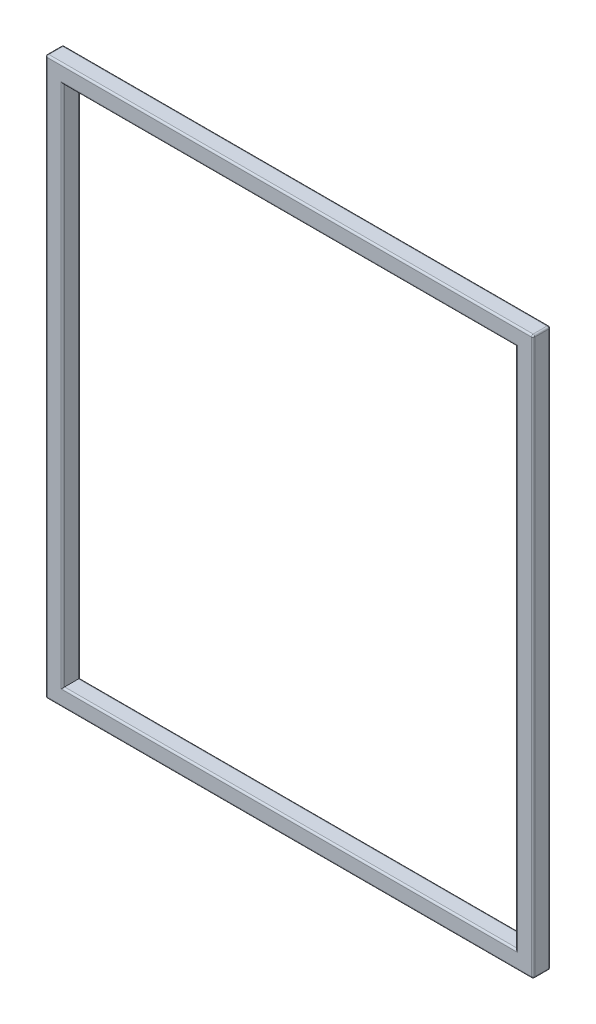
ISO-10303-21;
HEADER;
FILE_DESCRIPTION(('STEP AP214'),'2;1');
FILE_NAME('part.step','',(''),(''),'','','');
FILE_SCHEMA(('AUTOMOTIVE_DESIGN { 1 0 10303 214 1 1 1 1 }'));
ENDSEC;
DATA;
#1=APPLICATION_CONTEXT('core data for automotive mechanical design processes');
#2=APPLICATION_PROTOCOL_DEFINITION('international standard','automotive_design',2000,#1);
#3=PRODUCT_CONTEXT('',#1,'mechanical');
#4=PRODUCT('Part','Part','',(#3));
#5=PRODUCT_RELATED_PRODUCT_CATEGORY('part','',(#4));
#6=PRODUCT_DEFINITION_FORMATION('','',#4);
#7=PRODUCT_DEFINITION_CONTEXT('part definition',#1,'design');
#8=PRODUCT_DEFINITION('design','',#6,#7);
#9=PRODUCT_DEFINITION_SHAPE('','',#8);
#10=(LENGTH_UNIT() NAMED_UNIT(*) SI_UNIT(.MILLI.,.METRE.));
#11=(NAMED_UNIT(*) PLANE_ANGLE_UNIT() SI_UNIT($,.RADIAN.));
#12=(NAMED_UNIT(*) SI_UNIT($,.STERADIAN.) SOLID_ANGLE_UNIT());
#13=UNCERTAINTY_MEASURE_WITH_UNIT(LENGTH_MEASURE(1.E-05),#10,'distance_accuracy_value','');
#14=(GEOMETRIC_REPRESENTATION_CONTEXT(3) GLOBAL_UNCERTAINTY_ASSIGNED_CONTEXT((#13)) GLOBAL_UNIT_ASSIGNED_CONTEXT((#10,
#11,#12)) REPRESENTATION_CONTEXT('',''));
#15=CARTESIAN_POINT('',(0.,0.,0.));
#16=DIRECTION('',(0.,0.,1.));
#17=DIRECTION('',(1.,0.,0.));
#18=AXIS2_PLACEMENT_3D('',#15,#16,#17);
#19=CARTESIAN_POINT('',(0.,0.,25.4));
#20=DIRECTION('',(0.,0.,1.));
#21=DIRECTION('',(1.,0.,0.));
#22=AXIS2_PLACEMENT_3D('',#19,#20,#21);
#23=PLANE('',#22);
#24=DIRECTION('',(-1.,0.,0.));
#25=VECTOR('',#24,1.);
#26=CARTESIAN_POINT('',(-1.32799754099394E-13,789.94,25.4));
#27=LINE('',#26,#25);
#28=CARTESIAN_POINT('',(-688.34,789.94,25.4));
#29=VERTEX_POINT('',#28);
#30=CARTESIAN_POINT('',(-22.86,789.94,25.4));
#31=VERTEX_POINT('',#30);
#32=EDGE_CURVE('E278',#29,#31,#27,.F.);
#33=ORIENTED_EDGE('',*,*,#32,.T.);
#34=DIRECTION('',(0.,1.,0.));
#35=VECTOR('',#34,1.);
#36=CARTESIAN_POINT('',(-22.86,0.,25.4));
#37=LINE('',#36,#35);
#38=CARTESIAN_POINT('',(-22.86,22.86,25.4));
#39=VERTEX_POINT('',#38);
#40=EDGE_CURVE('E281',#31,#39,#37,.F.);
#41=ORIENTED_EDGE('',*,*,#40,.T.);
#42=DIRECTION('',(1.,0.,0.));
#43=VECTOR('',#42,1.);
#44=CARTESIAN_POINT('',(0.,22.86,25.4));
#45=LINE('',#44,#43);
#46=CARTESIAN_POINT('',(-688.34,22.8599999999999,25.4));
#47=VERTEX_POINT('',#46);
#48=EDGE_CURVE('E272',#39,#47,#45,.F.);
#49=ORIENTED_EDGE('',*,*,#48,.T.);
#50=DIRECTION('',(0.,-1.,0.));
#51=VECTOR('',#50,1.);
#52=CARTESIAN_POINT('',(-688.34,0.,25.4));
#53=LINE('',#52,#51);
#54=EDGE_CURVE('E275',#47,#29,#53,.F.);
#55=ORIENTED_EDGE('',*,*,#54,.T.);
#56=EDGE_LOOP('',(#33,#41,#49,#55));
#57=FACE_BOUND('',#56,.T.);
#58=DIRECTION('',(1.,0.,0.));
#59=VECTOR('',#58,1.);
#60=CARTESIAN_POINT('',(0.,2.54,25.4));
#61=LINE('',#60,#59);
#62=CARTESIAN_POINT('',(-708.66,2.53999999999994,25.4));
#63=VERTEX_POINT('',#62);
#64=CARTESIAN_POINT('',(-2.54,2.54,25.4));
#65=VERTEX_POINT('',#64);
#66=EDGE_CURVE('E259',#63,#65,#61,.T.);
#67=ORIENTED_EDGE('',*,*,#66,.T.);
#68=DIRECTION('',(0.,1.,0.));
#69=VECTOR('',#68,1.);
#70=CARTESIAN_POINT('',(-2.54,812.8,25.4));
#71=LINE('',#70,#69);
#72=CARTESIAN_POINT('',(-2.54,810.26,25.4));
#73=VERTEX_POINT('',#72);
#74=EDGE_CURVE('E268',#65,#73,#71,.T.);
#75=ORIENTED_EDGE('',*,*,#74,.T.);
#76=DIRECTION('',(-1.,0.,0.));
#77=VECTOR('',#76,1.);
#78=CARTESIAN_POINT('',(-711.2,810.26,25.4));
#79=LINE('',#78,#77);
#80=CARTESIAN_POINT('',(-708.66,810.26,25.4));
#81=VERTEX_POINT('',#80);
#82=EDGE_CURVE('E265',#73,#81,#79,.T.);
#83=ORIENTED_EDGE('',*,*,#82,.T.);
#84=DIRECTION('',(0.,-1.,0.));
#85=VECTOR('',#84,1.);
#86=CARTESIAN_POINT('',(-708.66,0.,25.4));
#87=LINE('',#86,#85);
#88=EDGE_CURVE('E262',#81,#63,#87,.T.);
#89=ORIENTED_EDGE('',*,*,#88,.T.);
#90=EDGE_LOOP('',(#67,#75,#83,#89));
#91=FACE_BOUND('',#90,.T.);
#92=ADVANCED_FACE('F39',(#57,#91),#23,.T.);
#93=CARTESIAN_POINT('',(0.,0.,0.));
#94=DIRECTION('',(0.,0.,1.));
#95=DIRECTION('',(1.,0.,0.));
#96=AXIS2_PLACEMENT_3D('',#93,#94,#95);
#97=PLANE('',#96);
#98=DIRECTION('',(1.,0.,0.));
#99=VECTOR('',#98,1.);
#100=CARTESIAN_POINT('',(-25.4,22.86,0.));
#101=LINE('',#100,#99);
#102=CARTESIAN_POINT('',(-688.34,22.8599999999999,0.));
#103=VERTEX_POINT('',#102);
#104=CARTESIAN_POINT('',(-22.86,22.86,0.));
#105=VERTEX_POINT('',#104);
#106=EDGE_CURVE('E215',#103,#105,#101,.T.);
#107=ORIENTED_EDGE('',*,*,#106,.T.);
#108=DIRECTION('',(0.,1.,0.));
#109=VECTOR('',#108,1.);
#110=CARTESIAN_POINT('',(-22.86,787.4,0.));
#111=LINE('',#110,#109);
#112=CARTESIAN_POINT('',(-22.86,789.94,0.));
#113=VERTEX_POINT('',#112);
#114=EDGE_CURVE('E229',#105,#113,#111,.T.);
#115=ORIENTED_EDGE('',*,*,#114,.T.);
#116=DIRECTION('',(-1.,0.,0.));
#117=VECTOR('',#116,1.);
#118=CARTESIAN_POINT('',(-685.8,789.94,0.));
#119=LINE('',#118,#117);
#120=CARTESIAN_POINT('',(-688.34,789.94,0.));
#121=VERTEX_POINT('',#120);
#122=EDGE_CURVE('E226',#113,#121,#119,.T.);
#123=ORIENTED_EDGE('',*,*,#122,.T.);
#124=DIRECTION('',(0.,-1.,0.));
#125=VECTOR('',#124,1.);
#126=CARTESIAN_POINT('',(-688.34,25.3999999999999,0.));
#127=LINE('',#126,#125);
#128=EDGE_CURVE('E219',#121,#103,#127,.T.);
#129=ORIENTED_EDGE('',*,*,#128,.T.);
#130=EDGE_LOOP('',(#107,#115,#123,#129));
#131=FACE_BOUND('',#130,.T.);
#132=DIRECTION('',(-1.,0.,0.));
#133=VECTOR('',#132,1.);
#134=CARTESIAN_POINT('',(-1.26486123162652E-13,810.26,0.));
#135=LINE('',#134,#133);
#136=CARTESIAN_POINT('',(-708.66,810.26,0.));
#137=VERTEX_POINT('',#136);
#138=CARTESIAN_POINT('',(-2.54,810.26,0.));
#139=VERTEX_POINT('',#138);
#140=EDGE_CURVE('E212',#137,#139,#135,.F.);
#141=ORIENTED_EDGE('',*,*,#140,.T.);
#142=DIRECTION('',(0.,1.,0.));
#143=VECTOR('',#142,1.);
#144=CARTESIAN_POINT('',(-2.54,0.,0.));
#145=LINE('',#144,#143);
#146=CARTESIAN_POINT('',(-2.54,2.54,0.));
#147=VERTEX_POINT('',#146);
#148=EDGE_CURVE('E183',#139,#147,#145,.F.);
#149=ORIENTED_EDGE('',*,*,#148,.T.);
#150=DIRECTION('',(1.,0.,0.));
#151=VECTOR('',#150,1.);
#152=CARTESIAN_POINT('',(0.,2.54,0.));
#153=LINE('',#152,#151);
#154=CARTESIAN_POINT('',(-708.66,2.53999999999994,0.));
#155=VERTEX_POINT('',#154);
#156=EDGE_CURVE('E200',#147,#155,#153,.F.);
#157=ORIENTED_EDGE('',*,*,#156,.T.);
#158=DIRECTION('',(0.,-1.,0.));
#159=VECTOR('',#158,1.);
#160=CARTESIAN_POINT('',(-708.66,0.,0.));
#161=LINE('',#160,#159);
#162=EDGE_CURVE('E207',#155,#137,#161,.F.);
#163=ORIENTED_EDGE('',*,*,#162,.T.);
#164=EDGE_LOOP('',(#141,#149,#157,#163));
#165=FACE_BOUND('',#164,.T.);
#166=ADVANCED_FACE('F210',(#131,#165),#97,.F.);
#167=CARTESIAN_POINT('',(0.,0.,25.4));
#168=DIRECTION('',(-1.,0.,0.));
#169=DIRECTION('',(0.,-1.,0.));
#170=AXIS2_PLACEMENT_3D('',#167,#168,#169);
#171=PLANE('',#170);
#172=DIRECTION('',(0.,1.,0.));
#173=VECTOR('',#172,1.);
#174=CARTESIAN_POINT('',(0.,0.,22.86));
#175=LINE('',#174,#173);
#176=CARTESIAN_POINT('',(0.,810.26,22.86));
#177=VERTEX_POINT('',#176);
#178=CARTESIAN_POINT('',(0.,2.54,22.86));
#179=VERTEX_POINT('',#178);
#180=EDGE_CURVE('E288',#177,#179,#175,.F.);
#181=ORIENTED_EDGE('',*,*,#180,.T.);
#182=DIRECTION('',(0.,0.,-1.));
#183=VECTOR('',#182,1.);
#184=CARTESIAN_POINT('',(0.,2.54,25.4));
#185=LINE('',#184,#183);
#186=CARTESIAN_POINT('',(0.,2.54,2.54));
#187=VERTEX_POINT('',#186);
#188=EDGE_CURVE('E293',#179,#187,#185,.T.);
#189=ORIENTED_EDGE('',*,*,#188,.T.);
#190=DIRECTION('',(0.,1.,0.));
#191=VECTOR('',#190,1.);
#192=CARTESIAN_POINT('',(0.,0.,2.54));
#193=LINE('',#192,#191);
#194=CARTESIAN_POINT('',(0.,810.26,2.54));
#195=VERTEX_POINT('',#194);
#196=EDGE_CURVE('E186',#187,#195,#193,.T.);
#197=ORIENTED_EDGE('',*,*,#196,.T.);
#198=DIRECTION('',(0.,0.,-1.));
#199=VECTOR('',#198,1.);
#200=CARTESIAN_POINT('',(0.,810.26,25.4));
#201=LINE('',#200,#199);
#202=EDGE_CURVE('E285',#195,#177,#201,.F.);
#203=ORIENTED_EDGE('',*,*,#202,.T.);
#204=EDGE_LOOP('',(#181,#189,#197,#203));
#205=FACE_BOUND('',#204,.T.);
#206=ADVANCED_FACE('F502',(#205),#171,.F.);
#207=CARTESIAN_POINT('',(0.,812.8,25.4));
#208=DIRECTION('',(0.,-1.,0.));
#209=DIRECTION('',(1.,0.,0.));
#210=AXIS2_PLACEMENT_3D('',#207,#208,#209);
#211=PLANE('',#210);
#212=DIRECTION('',(-1.,0.,0.));
#213=VECTOR('',#212,1.);
#214=CARTESIAN_POINT('',(0.,812.8,2.54));
#215=LINE('',#214,#213);
#216=CARTESIAN_POINT('',(-2.54,812.8,2.54));
#217=VERTEX_POINT('',#216);
#218=CARTESIAN_POINT('',(-708.66,812.8,2.54));
#219=VERTEX_POINT('',#218);
#220=EDGE_CURVE('E302',#217,#219,#215,.T.);
#221=ORIENTED_EDGE('',*,*,#220,.T.);
#222=DIRECTION('',(0.,0.,-1.));
#223=VECTOR('',#222,1.);
#224=CARTESIAN_POINT('',(-708.66,812.8,25.4));
#225=LINE('',#224,#223);
#226=CARTESIAN_POINT('',(-708.66,812.8,22.86));
#227=VERTEX_POINT('',#226);
#228=EDGE_CURVE('E306',#219,#227,#225,.F.);
#229=ORIENTED_EDGE('',*,*,#228,.T.);
#230=DIRECTION('',(-1.,0.,0.));
#231=VECTOR('',#230,1.);
#232=CARTESIAN_POINT('',(0.,812.8,22.86));
#233=LINE('',#232,#231);
#234=CARTESIAN_POINT('',(-2.54,812.8,22.86));
#235=VERTEX_POINT('',#234);
#236=EDGE_CURVE('E299',#227,#235,#233,.F.);
#237=ORIENTED_EDGE('',*,*,#236,.T.);
#238=DIRECTION('',(0.,0.,-1.));
#239=VECTOR('',#238,1.);
#240=CARTESIAN_POINT('',(-2.54,812.8,25.4));
#241=LINE('',#240,#239);
#242=EDGE_CURVE('E296',#235,#217,#241,.T.);
#243=ORIENTED_EDGE('',*,*,#242,.T.);
#244=EDGE_LOOP('',(#221,#229,#237,#243));
#245=FACE_BOUND('',#244,.T.);
#246=ADVANCED_FACE('F513',(#245),#211,.F.);
#247=CARTESIAN_POINT('',(-711.2,0.,25.4));
#248=DIRECTION('',(1.,0.,0.));
#249=DIRECTION('',(0.,0.,-1.));
#250=AXIS2_PLACEMENT_3D('',#247,#248,#249);
#251=PLANE('',#250);
#252=DIRECTION('',(0.,-1.,0.));
#253=VECTOR('',#252,1.);
#254=CARTESIAN_POINT('',(-711.2,0.,2.54));
#255=LINE('',#254,#253);
#256=CARTESIAN_POINT('',(-711.2,810.26,2.54));
#257=VERTEX_POINT('',#256);
#258=CARTESIAN_POINT('',(-711.2,2.53999999999994,2.54));
#259=VERTEX_POINT('',#258);
#260=EDGE_CURVE('E315',#257,#259,#255,.T.);
#261=ORIENTED_EDGE('',*,*,#260,.T.);
#262=DIRECTION('',(0.,0.,-1.));
#263=VECTOR('',#262,1.);
#264=CARTESIAN_POINT('',(-711.2,2.53999999999994,25.4));
#265=LINE('',#264,#263);
#266=CARTESIAN_POINT('',(-711.2,2.53999999999994,22.86));
#267=VERTEX_POINT('',#266);
#268=EDGE_CURVE('E319',#259,#267,#265,.F.);
#269=ORIENTED_EDGE('',*,*,#268,.T.);
#270=DIRECTION('',(0.,-1.,0.));
#271=VECTOR('',#270,1.);
#272=CARTESIAN_POINT('',(-711.2,812.8,22.86));
#273=LINE('',#272,#271);
#274=CARTESIAN_POINT('',(-711.2,810.26,22.86));
#275=VERTEX_POINT('',#274);
#276=EDGE_CURVE('E312',#267,#275,#273,.F.);
#277=ORIENTED_EDGE('',*,*,#276,.T.);
#278=DIRECTION('',(0.,0.,-1.));
#279=VECTOR('',#278,1.);
#280=CARTESIAN_POINT('',(-711.2,810.26,25.4));
#281=LINE('',#280,#279);
#282=EDGE_CURVE('E309',#275,#257,#281,.T.);
#283=ORIENTED_EDGE('',*,*,#282,.T.);
#284=EDGE_LOOP('',(#261,#269,#277,#283));
#285=FACE_BOUND('',#284,.T.);
#286=ADVANCED_FACE('F477',(#285),#251,.F.);
#287=CARTESIAN_POINT('',(0.,0.,25.4));
#288=DIRECTION('',(0.,1.,0.));
#289=DIRECTION('',(-1.,0.,0.));
#290=AXIS2_PLACEMENT_3D('',#287,#288,#289);
#291=PLANE('',#290);
#292=DIRECTION('',(1.,0.,0.));
#293=VECTOR('',#292,1.);
#294=CARTESIAN_POINT('',(0.,0.,2.54));
#295=LINE('',#294,#293);
#296=CARTESIAN_POINT('',(-708.66,0.,2.54));
#297=VERTEX_POINT('',#296);
#298=CARTESIAN_POINT('',(-2.54,0.,2.54));
#299=VERTEX_POINT('',#298);
#300=EDGE_CURVE('E49',#297,#299,#295,.T.);
#301=ORIENTED_EDGE('',*,*,#300,.T.);
#302=DIRECTION('',(0.,0.,-1.));
#303=VECTOR('',#302,1.);
#304=CARTESIAN_POINT('',(-2.54,0.,25.4));
#305=LINE('',#304,#303);
#306=CARTESIAN_POINT('',(-2.54,0.,22.86));
#307=VERTEX_POINT('',#306);
#308=EDGE_CURVE('E11',#299,#307,#305,.F.);
#309=ORIENTED_EDGE('',*,*,#308,.T.);
#310=DIRECTION('',(1.,0.,0.));
#311=VECTOR('',#310,1.);
#312=CARTESIAN_POINT('',(-711.2,0.,22.86));
#313=LINE('',#312,#311);
#314=CARTESIAN_POINT('',(-708.66,0.,22.86));
#315=VERTEX_POINT('',#314);
#316=EDGE_CURVE('E325',#307,#315,#313,.F.);
#317=ORIENTED_EDGE('',*,*,#316,.T.);
#318=DIRECTION('',(0.,0.,-1.));
#319=VECTOR('',#318,1.);
#320=CARTESIAN_POINT('',(-708.66,0.,25.4));
#321=LINE('',#320,#319);
#322=EDGE_CURVE('E322',#315,#297,#321,.T.);
#323=ORIENTED_EDGE('',*,*,#322,.T.);
#324=EDGE_LOOP('',(#301,#309,#317,#323));
#325=FACE_BOUND('',#324,.T.);
#326=ADVANCED_FACE('F450',(#325),#291,.F.);
#327=CARTESIAN_POINT('',(-25.4,25.4,25.4));
#328=DIRECTION('',(-1.,0.,0.));
#329=DIRECTION('',(0.,0.,1.));
#330=AXIS2_PLACEMENT_3D('',#327,#328,#329);
#331=PLANE('',#330);
#332=DIRECTION('',(0.,0.,-1.));
#333=VECTOR('',#332,1.);
#334=CARTESIAN_POINT('',(-25.4,787.4,25.4));
#335=LINE('',#334,#333);
#336=CARTESIAN_POINT('',(-25.4,787.4,22.86));
#337=VERTEX_POINT('',#336);
#338=CARTESIAN_POINT('',(-25.4,787.4,2.54));
#339=VERTEX_POINT('',#338);
#340=EDGE_CURVE('E208',#337,#339,#335,.T.);
#341=ORIENTED_EDGE('',*,*,#340,.T.);
#342=DIRECTION('',(0.,1.,0.));
#343=VECTOR('',#342,1.);
#344=CARTESIAN_POINT('',(-25.4,25.4,2.54));
#345=LINE('',#344,#343);
#346=CARTESIAN_POINT('',(-25.4,25.4,2.54));
#347=VERTEX_POINT('',#346);
#348=EDGE_CURVE('E237',#339,#347,#345,.F.);
#349=ORIENTED_EDGE('',*,*,#348,.T.);
#350=DIRECTION('',(0.,0.,-1.));
#351=VECTOR('',#350,1.);
#352=CARTESIAN_POINT('',(-25.4,25.4,25.4));
#353=LINE('',#352,#351);
#354=CARTESIAN_POINT('',(-25.4,25.4,22.86));
#355=VERTEX_POINT('',#354);
#356=EDGE_CURVE('E345',#355,#347,#353,.T.);
#357=ORIENTED_EDGE('',*,*,#356,.F.);
#358=DIRECTION('',(0.,1.,0.));
#359=VECTOR('',#358,1.);
#360=CARTESIAN_POINT('',(-25.4,25.4,22.86));
#361=LINE('',#360,#359);
#362=EDGE_CURVE('E233',#355,#337,#361,.T.);
#363=ORIENTED_EDGE('',*,*,#362,.T.);
#364=EDGE_LOOP('',(#341,#349,#357,#363));
#365=FACE_BOUND('',#364,.T.);
#366=ADVANCED_FACE('F506',(#365),#331,.T.);
#367=CARTESIAN_POINT('',(-25.4,787.4,25.4));
#368=DIRECTION('',(0.,-1.,0.));
#369=DIRECTION('',(1.,0.,0.));
#370=AXIS2_PLACEMENT_3D('',#367,#368,#369);
#371=PLANE('',#370);
#372=DIRECTION('',(0.,0.,-1.));
#373=VECTOR('',#372,1.);
#374=CARTESIAN_POINT('',(-685.8,787.4,25.4));
#375=LINE('',#374,#373);
#376=CARTESIAN_POINT('',(-685.8,787.4,22.86));
#377=VERTEX_POINT('',#376);
#378=CARTESIAN_POINT('',(-685.8,787.4,2.54));
#379=VERTEX_POINT('',#378);
#380=EDGE_CURVE('E842',#377,#379,#375,.T.);
#381=ORIENTED_EDGE('',*,*,#380,.T.);
#382=DIRECTION('',(-1.,0.,0.));
#383=VECTOR('',#382,1.);
#384=CARTESIAN_POINT('',(-25.4,787.4,2.54));
#385=LINE('',#384,#383);
#386=EDGE_CURVE('E244',#379,#339,#385,.F.);
#387=ORIENTED_EDGE('',*,*,#386,.T.);
#388=ORIENTED_EDGE('',*,*,#340,.F.);
#389=DIRECTION('',(-1.,0.,0.));
#390=VECTOR('',#389,1.);
#391=CARTESIAN_POINT('',(-25.4,787.4,22.86));
#392=LINE('',#391,#390);
#393=EDGE_CURVE('E241',#337,#377,#392,.T.);
#394=ORIENTED_EDGE('',*,*,#393,.T.);
#395=EDGE_LOOP('',(#381,#387,#388,#394));
#396=FACE_BOUND('',#395,.T.);
#397=ADVANCED_FACE('F763',(#396),#371,.T.);
#398=CARTESIAN_POINT('',(-685.8,25.3999999999999,25.4));
#399=DIRECTION('',(1.,0.,0.));
#400=DIRECTION('',(0.,0.,-1.));
#401=AXIS2_PLACEMENT_3D('',#398,#399,#400);
#402=PLANE('',#401);
#403=DIRECTION('',(0.,0.,-1.));
#404=VECTOR('',#403,1.);
#405=CARTESIAN_POINT('',(-685.8,25.3999999999999,25.4));
#406=LINE('',#405,#404);
#407=CARTESIAN_POINT('',(-685.8,25.3999999999999,22.86));
#408=VERTEX_POINT('',#407);
#409=CARTESIAN_POINT('',(-685.8,25.3999999999999,2.54));
#410=VERTEX_POINT('',#409);
#411=EDGE_CURVE('E856',#408,#410,#406,.T.);
#412=ORIENTED_EDGE('',*,*,#411,.T.);
#413=DIRECTION('',(0.,-1.,0.));
#414=VECTOR('',#413,1.);
#415=CARTESIAN_POINT('',(-685.8,787.4,2.54));
#416=LINE('',#415,#414);
#417=EDGE_CURVE('E250',#410,#379,#416,.F.);
#418=ORIENTED_EDGE('',*,*,#417,.T.);
#419=ORIENTED_EDGE('',*,*,#380,.F.);
#420=DIRECTION('',(0.,-1.,0.));
#421=VECTOR('',#420,1.);
#422=CARTESIAN_POINT('',(-685.8,25.3999999999999,22.86));
#423=LINE('',#422,#421);
#424=EDGE_CURVE('E247',#377,#408,#423,.T.);
#425=ORIENTED_EDGE('',*,*,#424,.T.);
#426=EDGE_LOOP('',(#412,#418,#419,#425));
#427=FACE_BOUND('',#426,.T.);
#428=ADVANCED_FACE('F754',(#427),#402,.T.);
#429=CARTESIAN_POINT('',(-25.4,25.4,25.4));
#430=DIRECTION('',(0.,1.,0.));
#431=DIRECTION('',(-1.,0.,0.));
#432=AXIS2_PLACEMENT_3D('',#429,#430,#431);
#433=PLANE('',#432);
#434=ORIENTED_EDGE('',*,*,#356,.T.);
#435=DIRECTION('',(1.,0.,0.));
#436=VECTOR('',#435,1.);
#437=CARTESIAN_POINT('',(-685.8,25.3999999999999,2.54));
#438=LINE('',#437,#436);
#439=EDGE_CURVE('E256',#347,#410,#438,.F.);
#440=ORIENTED_EDGE('',*,*,#439,.T.);
#441=ORIENTED_EDGE('',*,*,#411,.F.);
#442=DIRECTION('',(1.,0.,0.));
#443=VECTOR('',#442,1.);
#444=CARTESIAN_POINT('',(-25.4,25.4,22.86));
#445=LINE('',#444,#443);
#446=EDGE_CURVE('E253',#408,#355,#445,.T.);
#447=ORIENTED_EDGE('',*,*,#446,.T.);
#448=EDGE_LOOP('',(#434,#440,#441,#447));
#449=FACE_BOUND('',#448,.T.);
#450=ADVANCED_FACE('F536',(#449),#433,.T.);
#451=CARTESIAN_POINT('',(-688.34,0.,2.54));
#452=DIRECTION('',(0.,1.,0.));
#453=DIRECTION('',(0.,0.,1.));
#454=AXIS2_PLACEMENT_3D('',#451,#452,#453);
#455=CYLINDRICAL_SURFACE('',#454,2.54);
#456=CARTESIAN_POINT('',(-688.34,789.94,2.54));
#457=DIRECTION('',(0.707106781186547,0.707106781186548,0.));
#458=DIRECTION('',(0.707106781186548,-0.707106781186547,0.));
#459=AXIS2_PLACEMENT_3D('',#456,#457,#458);
#460=ELLIPSE('',#459,3.59210244842766,2.54);
#461=EDGE_CURVE('E337',#379,#121,#460,.T.);
#462=ORIENTED_EDGE('',*,*,#461,.F.);
#463=ORIENTED_EDGE('',*,*,#417,.F.);
#464=CARTESIAN_POINT('',(-688.34,22.8599999999999,2.54));
#465=DIRECTION('',(-0.707106781186548,0.707106781186547,0.));
#466=DIRECTION('',(0.707106781186547,0.707106781186548,0.));
#467=AXIS2_PLACEMENT_3D('',#464,#465,#466);
#468=ELLIPSE('',#467,3.59210244842766,2.54);
#469=EDGE_CURVE('E341',#103,#410,#468,.F.);
#470=ORIENTED_EDGE('',*,*,#469,.F.);
#471=ORIENTED_EDGE('',*,*,#128,.F.);
#472=EDGE_LOOP('',(#462,#463,#470,#471));
#473=FACE_BOUND('',#472,.T.);
#474=ADVANCED_FACE('F532',(#473),#455,.T.);
#475=CARTESIAN_POINT('',(0.,22.86,2.54));
#476=DIRECTION('',(-1.,0.,0.));
#477=DIRECTION('',(0.,-1.,0.));
#478=AXIS2_PLACEMENT_3D('',#475,#476,#477);
#479=CYLINDRICAL_SURFACE('',#478,2.54);
#480=ORIENTED_EDGE('',*,*,#469,.T.);
#481=ORIENTED_EDGE('',*,*,#439,.F.);
#482=CARTESIAN_POINT('',(-22.86,22.86,2.54));
#483=DIRECTION('',(-0.707106781186547,-0.707106781186548,0.));
#484=DIRECTION('',(0.707106781186548,-0.707106781186547,0.));
#485=AXIS2_PLACEMENT_3D('',#482,#483,#484);
#486=ELLIPSE('',#485,3.59210244842766,2.54);
#487=EDGE_CURVE('E333',#105,#347,#486,.F.);
#488=ORIENTED_EDGE('',*,*,#487,.F.);
#489=ORIENTED_EDGE('',*,*,#106,.F.);
#490=EDGE_LOOP('',(#480,#481,#488,#489));
#491=FACE_BOUND('',#490,.T.);
#492=ADVANCED_FACE('F528',(#491),#479,.T.);
#493=CARTESIAN_POINT('',(-1.32799754099394E-13,789.94,2.54));
#494=DIRECTION('',(1.,0.,0.));
#495=DIRECTION('',(0.,1.,0.));
#496=AXIS2_PLACEMENT_3D('',#493,#494,#495);
#497=CYLINDRICAL_SURFACE('',#496,2.54);
#498=ORIENTED_EDGE('',*,*,#461,.T.);
#499=ORIENTED_EDGE('',*,*,#122,.F.);
#500=CARTESIAN_POINT('',(-22.86,789.94,2.54));
#501=DIRECTION('',(0.707106781186548,-0.707106781186547,0.));
#502=DIRECTION('',(-0.707106781186547,-0.707106781186548,0.));
#503=AXIS2_PLACEMENT_3D('',#500,#501,#502);
#504=ELLIPSE('',#503,3.59210244842766,2.54);
#505=EDGE_CURVE('E330',#339,#113,#504,.T.);
#506=ORIENTED_EDGE('',*,*,#505,.F.);
#507=ORIENTED_EDGE('',*,*,#386,.F.);
#508=EDGE_LOOP('',(#498,#499,#506,#507));
#509=FACE_BOUND('',#508,.T.);
#510=ADVANCED_FACE('F524',(#509),#497,.T.);
#511=CARTESIAN_POINT('',(-22.86,0.,2.54));
#512=DIRECTION('',(0.,-1.,0.));
#513=DIRECTION('',(0.,0.,-1.));
#514=AXIS2_PLACEMENT_3D('',#511,#512,#513);
#515=CYLINDRICAL_SURFACE('',#514,2.54);
#516=ORIENTED_EDGE('',*,*,#487,.T.);
#517=ORIENTED_EDGE('',*,*,#348,.F.);
#518=ORIENTED_EDGE('',*,*,#505,.T.);
#519=ORIENTED_EDGE('',*,*,#114,.F.);
#520=EDGE_LOOP('',(#516,#517,#518,#519));
#521=FACE_BOUND('',#520,.T.);
#522=ADVANCED_FACE('F520',(#521),#515,.T.);
#523=CARTESIAN_POINT('',(-688.34,25.3999999999999,22.86));
#524=DIRECTION('',(0.,-1.,0.));
#525=DIRECTION('',(0.,0.,-1.));
#526=AXIS2_PLACEMENT_3D('',#523,#524,#525);
#527=CYLINDRICAL_SURFACE('',#526,2.54);
#528=CARTESIAN_POINT('',(-688.34,789.94,22.86));
#529=DIRECTION('',(-0.707106781186547,-0.707106781186548,0.));
#530=DIRECTION('',(-0.707106781186548,0.707106781186547,0.));
#531=AXIS2_PLACEMENT_3D('',#528,#529,#530);
#532=ELLIPSE('',#531,3.59210244842766,2.54);
#533=EDGE_CURVE('E352',#29,#377,#532,.F.);
#534=ORIENTED_EDGE('',*,*,#533,.F.);
#535=ORIENTED_EDGE('',*,*,#54,.F.);
#536=CARTESIAN_POINT('',(-688.34,22.8599999999999,22.86));
#537=DIRECTION('',(0.707106781186548,-0.707106781186547,0.));
#538=DIRECTION('',(-0.707106781186547,-0.707106781186548,0.));
#539=AXIS2_PLACEMENT_3D('',#536,#537,#538);
#540=ELLIPSE('',#539,3.59210244842766,2.54);
#541=EDGE_CURVE('E334',#408,#47,#540,.T.);
#542=ORIENTED_EDGE('',*,*,#541,.F.);
#543=ORIENTED_EDGE('',*,*,#424,.F.);
#544=EDGE_LOOP('',(#534,#535,#542,#543));
#545=FACE_BOUND('',#544,.T.);
#546=ADVANCED_FACE('F523',(#545),#527,.T.);
#547=CARTESIAN_POINT('',(-25.4,22.86,22.86));
#548=DIRECTION('',(1.,0.,0.));
#549=DIRECTION('',(0.,1.,0.));
#550=AXIS2_PLACEMENT_3D('',#547,#548,#549);
#551=CYLINDRICAL_SURFACE('',#550,2.54);
#552=ORIENTED_EDGE('',*,*,#541,.T.);
#553=ORIENTED_EDGE('',*,*,#48,.F.);
#554=CARTESIAN_POINT('',(-22.86,22.86,22.86));
#555=DIRECTION('',(0.707106781186547,0.707106781186548,0.));
#556=DIRECTION('',(-0.707106781186548,0.707106781186547,0.));
#557=AXIS2_PLACEMENT_3D('',#554,#555,#556);
#558=ELLIPSE('',#557,3.59210244842766,2.54);
#559=EDGE_CURVE('E349',#355,#39,#558,.T.);
#560=ORIENTED_EDGE('',*,*,#559,.F.);
#561=ORIENTED_EDGE('',*,*,#446,.F.);
#562=EDGE_LOOP('',(#552,#553,#560,#561));
#563=FACE_BOUND('',#562,.T.);
#564=ADVANCED_FACE('F545',(#563),#551,.T.);
#565=CARTESIAN_POINT('',(-25.4,789.94,22.86));
#566=DIRECTION('',(-1.,0.,0.));
#567=DIRECTION('',(0.,-1.,0.));
#568=AXIS2_PLACEMENT_3D('',#565,#566,#567);
#569=CYLINDRICAL_SURFACE('',#568,2.54);
#570=ORIENTED_EDGE('',*,*,#533,.T.);
#571=ORIENTED_EDGE('',*,*,#393,.F.);
#572=CARTESIAN_POINT('',(-22.86,789.94,22.86));
#573=DIRECTION('',(-0.707106781186548,0.707106781186547,0.));
#574=DIRECTION('',(0.707106781186547,0.707106781186548,0.));
#575=AXIS2_PLACEMENT_3D('',#572,#573,#574);
#576=ELLIPSE('',#575,3.59210244842766,2.54);
#577=EDGE_CURVE('E346',#31,#337,#576,.F.);
#578=ORIENTED_EDGE('',*,*,#577,.F.);
#579=ORIENTED_EDGE('',*,*,#32,.F.);
#580=EDGE_LOOP('',(#570,#571,#578,#579));
#581=FACE_BOUND('',#580,.T.);
#582=ADVANCED_FACE('F541',(#581),#569,.T.);
#583=CARTESIAN_POINT('',(-22.86,25.4,22.86));
#584=DIRECTION('',(0.,1.,0.));
#585=DIRECTION('',(0.,0.,1.));
#586=AXIS2_PLACEMENT_3D('',#583,#584,#585);
#587=CYLINDRICAL_SURFACE('',#586,2.54);
#588=ORIENTED_EDGE('',*,*,#559,.T.);
#589=ORIENTED_EDGE('',*,*,#40,.F.);
#590=ORIENTED_EDGE('',*,*,#577,.T.);
#591=ORIENTED_EDGE('',*,*,#362,.F.);
#592=EDGE_LOOP('',(#588,#589,#590,#591));
#593=FACE_BOUND('',#592,.T.);
#594=ADVANCED_FACE('F538',(#593),#587,.T.);
#595=CARTESIAN_POINT('',(-708.66,0.,22.86));
#596=DIRECTION('',(0.,1.,0.));
#597=DIRECTION('',(0.,0.,1.));
#598=AXIS2_PLACEMENT_3D('',#595,#596,#597);
#599=CYLINDRICAL_SURFACE('',#598,2.54);
#600=CARTESIAN_POINT('',(-708.66,2.53999999999994,22.86));
#601=DIRECTION('',(0.,-1.,0.));
#602=DIRECTION('',(0.,0.,-1.));
#603=AXIS2_PLACEMENT_3D('',#600,#601,#602);
#604=CIRCLE('',#603,2.54);
#605=EDGE_CURVE('E43',#63,#267,#604,.T.);
#606=ORIENTED_EDGE('',*,*,#605,.F.);
#607=ORIENTED_EDGE('',*,*,#88,.F.);
#608=CARTESIAN_POINT('',(-708.66,810.26,22.86));
#609=DIRECTION('',(0.,1.,0.));
#610=DIRECTION('',(0.,0.,1.));
#611=AXIS2_PLACEMENT_3D('',#608,#609,#610);
#612=CIRCLE('',#611,2.54);
#613=EDGE_CURVE('E427',#275,#81,#612,.T.);
#614=ORIENTED_EDGE('',*,*,#613,.F.);
#615=ORIENTED_EDGE('',*,*,#276,.F.);
#616=EDGE_LOOP('',(#606,#607,#614,#615));
#617=FACE_BOUND('',#616,.T.);
#618=ADVANCED_FACE('F41',(#617),#599,.T.);
#619=CARTESIAN_POINT('',(-708.66,2.53999999999994,22.86));
#620=DIRECTION('',(0.,0.,1.));
#621=DIRECTION('',(1.,0.,0.));
#622=AXIS2_PLACEMENT_3D('',#619,#620,#621);
#623=SPHERICAL_SURFACE('',#622,2.54);
#624=CARTESIAN_POINT('',(-708.66,2.53999999999994,22.86));
#625=DIRECTION('',(-1.,0.,0.));
#626=DIRECTION('',(0.,0.,1.));
#627=AXIS2_PLACEMENT_3D('',#624,#625,#626);
#628=CIRCLE('',#627,2.54);
#629=EDGE_CURVE('E420',#63,#315,#628,.F.);
#630=ORIENTED_EDGE('',*,*,#629,.F.);
#631=ORIENTED_EDGE('',*,*,#605,.T.);
#632=CARTESIAN_POINT('',(-708.66,2.53999999999994,22.86));
#633=DIRECTION('',(0.,0.,1.));
#634=DIRECTION('',(1.,0.,0.));
#635=AXIS2_PLACEMENT_3D('',#632,#633,#634);
#636=CIRCLE('',#635,2.54);
#637=EDGE_CURVE('E424',#315,#267,#636,.F.);
#638=ORIENTED_EDGE('',*,*,#637,.F.);
#639=EDGE_LOOP('',(#630,#631,#638));
#640=FACE_BOUND('',#639,.T.);
#641=ADVANCED_FACE('F440',(#640),#623,.T.);
#642=CARTESIAN_POINT('',(-708.66,810.26,22.86));
#643=DIRECTION('',(0.,0.,1.));
#644=DIRECTION('',(1.,0.,0.));
#645=AXIS2_PLACEMENT_3D('',#642,#643,#644);
#646=SPHERICAL_SURFACE('',#645,2.54);
#647=CARTESIAN_POINT('',(-708.66,810.26,22.86));
#648=DIRECTION('',(0.,0.,1.));
#649=DIRECTION('',(1.,0.,0.));
#650=AXIS2_PLACEMENT_3D('',#647,#648,#649);
#651=CIRCLE('',#650,2.54);
#652=EDGE_CURVE('E412',#275,#227,#651,.F.);
#653=ORIENTED_EDGE('',*,*,#652,.F.);
#654=ORIENTED_EDGE('',*,*,#613,.T.);
#655=CARTESIAN_POINT('',(-708.66,810.26,22.86));
#656=DIRECTION('',(-1.,0.,0.));
#657=DIRECTION('',(0.,0.,1.));
#658=AXIS2_PLACEMENT_3D('',#655,#656,#657);
#659=CIRCLE('',#658,2.54);
#660=EDGE_CURVE('E416',#227,#81,#659,.F.);
#661=ORIENTED_EDGE('',*,*,#660,.F.);
#662=EDGE_LOOP('',(#653,#654,#661));
#663=FACE_BOUND('',#662,.T.);
#664=ADVANCED_FACE('F470',(#663),#646,.T.);
#665=CARTESIAN_POINT('',(-708.66,2.53999999999994,25.4));
#666=DIRECTION('',(0.,0.,-1.));
#667=DIRECTION('',(-1.,0.,0.));
#668=AXIS2_PLACEMENT_3D('',#665,#666,#667);
#669=CYLINDRICAL_SURFACE('',#668,2.54);
#670=ORIENTED_EDGE('',*,*,#637,.T.);
#671=ORIENTED_EDGE('',*,*,#268,.F.);
#672=CARTESIAN_POINT('',(-708.66,2.53999999999994,2.54));
#673=DIRECTION('',(0.,0.,-1.));
#674=DIRECTION('',(-1.,0.,0.));
#675=AXIS2_PLACEMENT_3D('',#672,#673,#674);
#676=CIRCLE('',#675,2.54);
#677=EDGE_CURVE('E405',#297,#259,#676,.T.);
#678=ORIENTED_EDGE('',*,*,#677,.F.);
#679=ORIENTED_EDGE('',*,*,#322,.F.);
#680=EDGE_LOOP('',(#670,#671,#678,#679));
#681=FACE_BOUND('',#680,.T.);
#682=ADVANCED_FACE('F448',(#681),#669,.T.);
#683=CARTESIAN_POINT('',(0.,2.54,22.86));
#684=DIRECTION('',(-1.,0.,0.));
#685=DIRECTION('',(0.,-1.,0.));
#686=AXIS2_PLACEMENT_3D('',#683,#684,#685);
#687=CYLINDRICAL_SURFACE('',#686,2.54);
#688=ORIENTED_EDGE('',*,*,#629,.T.);
#689=ORIENTED_EDGE('',*,*,#316,.F.);
#690=CARTESIAN_POINT('',(-2.54,2.54,22.86));
#691=DIRECTION('',(1.,0.,0.));
#692=DIRECTION('',(0.,1.,0.));
#693=AXIS2_PLACEMENT_3D('',#690,#691,#692);
#694=CIRCLE('',#693,2.54);
#695=EDGE_CURVE('E401',#65,#307,#694,.T.);
#696=ORIENTED_EDGE('',*,*,#695,.F.);
#697=ORIENTED_EDGE('',*,*,#66,.F.);
#698=EDGE_LOOP('',(#688,#689,#696,#697));
#699=FACE_BOUND('',#698,.T.);
#700=ADVANCED_FACE('F453',(#699),#687,.T.);
#701=CARTESIAN_POINT('',(-2.54,0.,22.86));
#702=DIRECTION('',(0.,-1.,0.));
#703=DIRECTION('',(1.,0.,0.));
#704=AXIS2_PLACEMENT_3D('',#701,#702,#703);
#705=CYLINDRICAL_SURFACE('',#704,2.54);
#706=CARTESIAN_POINT('',(-2.54,810.26,22.86));
#707=DIRECTION('',(0.,1.,0.));
#708=DIRECTION('',(0.,0.,1.));
#709=AXIS2_PLACEMENT_3D('',#706,#707,#708);
#710=CIRCLE('',#709,2.54);
#711=EDGE_CURVE('E393',#73,#177,#710,.T.);
#712=ORIENTED_EDGE('',*,*,#711,.F.);
#713=ORIENTED_EDGE('',*,*,#74,.F.);
#714=CARTESIAN_POINT('',(-2.54,2.54,22.86));
#715=DIRECTION('',(0.,-1.,0.));
#716=DIRECTION('',(0.,0.,-1.));
#717=AXIS2_PLACEMENT_3D('',#714,#715,#716);
#718=CIRCLE('',#717,2.54);
#719=EDGE_CURVE('E397',#179,#65,#718,.T.);
#720=ORIENTED_EDGE('',*,*,#719,.F.);
#721=ORIENTED_EDGE('',*,*,#180,.F.);
#722=EDGE_LOOP('',(#712,#713,#720,#721));
#723=FACE_BOUND('',#722,.T.);
#724=ADVANCED_FACE('F459',(#723),#705,.T.);
#725=CARTESIAN_POINT('',(-1.26486123162652E-13,810.26,22.86));
#726=DIRECTION('',(1.,0.,0.));
#727=DIRECTION('',(0.,1.,0.));
#728=AXIS2_PLACEMENT_3D('',#725,#726,#727);
#729=CYLINDRICAL_SURFACE('',#728,2.54);
#730=ORIENTED_EDGE('',*,*,#660,.T.);
#731=ORIENTED_EDGE('',*,*,#82,.F.);
#732=CARTESIAN_POINT('',(-2.54,810.26,22.86));
#733=DIRECTION('',(1.,0.,0.));
#734=DIRECTION('',(0.,1.,0.));
#735=AXIS2_PLACEMENT_3D('',#732,#733,#734);
#736=CIRCLE('',#735,2.54);
#737=EDGE_CURVE('E390',#235,#73,#736,.T.);
#738=ORIENTED_EDGE('',*,*,#737,.F.);
#739=ORIENTED_EDGE('',*,*,#236,.F.);
#740=EDGE_LOOP('',(#730,#731,#738,#739));
#741=FACE_BOUND('',#740,.T.);
#742=ADVANCED_FACE('F467',(#741),#729,.T.);
#743=CARTESIAN_POINT('',(-708.66,810.26,25.4));
#744=DIRECTION('',(0.,0.,-1.));
#745=DIRECTION('',(-1.,0.,0.));
#746=AXIS2_PLACEMENT_3D('',#743,#744,#745);
#747=CYLINDRICAL_SURFACE('',#746,2.54);
#748=ORIENTED_EDGE('',*,*,#652,.T.);
#749=ORIENTED_EDGE('',*,*,#228,.F.);
#750=CARTESIAN_POINT('',(-708.66,810.26,2.54));
#751=DIRECTION('',(0.,0.,-1.));
#752=DIRECTION('',(-1.,0.,0.));
#753=AXIS2_PLACEMENT_3D('',#750,#751,#752);
#754=CIRCLE('',#753,2.54);
#755=EDGE_CURVE('E386',#257,#219,#754,.T.);
#756=ORIENTED_EDGE('',*,*,#755,.F.);
#757=ORIENTED_EDGE('',*,*,#282,.F.);
#758=EDGE_LOOP('',(#748,#749,#756,#757));
#759=FACE_BOUND('',#758,.T.);
#760=ADVANCED_FACE('F474',(#759),#747,.T.);
#761=CARTESIAN_POINT('',(-708.66,0.,2.54));
#762=DIRECTION('',(0.,-1.,0.));
#763=DIRECTION('',(0.,0.,-1.));
#764=AXIS2_PLACEMENT_3D('',#761,#762,#763);
#765=CYLINDRICAL_SURFACE('',#764,2.54);
#766=CARTESIAN_POINT('',(-708.66,2.53999999999994,2.54));
#767=DIRECTION('',(0.,-1.,0.));
#768=DIRECTION('',(0.,0.,-1.));
#769=AXIS2_PLACEMENT_3D('',#766,#767,#768);
#770=CIRCLE('',#769,2.54);
#771=EDGE_CURVE('E408',#259,#155,#770,.T.);
#772=ORIENTED_EDGE('',*,*,#771,.F.);
#773=ORIENTED_EDGE('',*,*,#260,.F.);
#774=CARTESIAN_POINT('',(-708.66,810.26,2.54));
#775=DIRECTION('',(0.,1.,0.));
#776=DIRECTION('',(0.,0.,1.));
#777=AXIS2_PLACEMENT_3D('',#774,#775,#776);
#778=CIRCLE('',#777,2.54);
#779=EDGE_CURVE('E382',#137,#257,#778,.T.);
#780=ORIENTED_EDGE('',*,*,#779,.F.);
#781=ORIENTED_EDGE('',*,*,#162,.F.);
#782=EDGE_LOOP('',(#772,#773,#780,#781));
#783=FACE_BOUND('',#782,.T.);
#784=ADVANCED_FACE('F481',(#783),#765,.T.);
#785=CARTESIAN_POINT('',(-708.66,2.53999999999994,2.54));
#786=DIRECTION('',(0.,0.,1.));
#787=DIRECTION('',(1.,0.,0.));
#788=AXIS2_PLACEMENT_3D('',#785,#786,#787);
#789=SPHERICAL_SURFACE('',#788,2.54);
#790=ORIENTED_EDGE('',*,*,#677,.T.);
#791=ORIENTED_EDGE('',*,*,#771,.T.);
#792=CARTESIAN_POINT('',(-708.66,2.53999999999994,2.54));
#793=DIRECTION('',(-1.,0.,0.));
#794=DIRECTION('',(0.,0.,1.));
#795=AXIS2_PLACEMENT_3D('',#792,#793,#794);
#796=CIRCLE('',#795,2.54);
#797=EDGE_CURVE('E203',#297,#155,#796,.F.);
#798=ORIENTED_EDGE('',*,*,#797,.F.);
#799=EDGE_LOOP('',(#790,#791,#798));
#800=FACE_BOUND('',#799,.T.);
#801=ADVANCED_FACE('F484',(#800),#789,.T.);
#802=CARTESIAN_POINT('',(-2.54,2.54,22.86));
#803=DIRECTION('',(0.,0.,1.));
#804=DIRECTION('',(1.,0.,0.));
#805=AXIS2_PLACEMENT_3D('',#802,#803,#804);
#806=SPHERICAL_SURFACE('',#805,2.54);
#807=ORIENTED_EDGE('',*,*,#719,.T.);
#808=ORIENTED_EDGE('',*,*,#695,.T.);
#809=CARTESIAN_POINT('',(-2.54,2.54,22.86));
#810=DIRECTION('',(0.,0.,1.));
#811=DIRECTION('',(1.,0.,0.));
#812=AXIS2_PLACEMENT_3D('',#809,#810,#811);
#813=CIRCLE('',#812,2.54);
#814=EDGE_CURVE('E376',#179,#307,#813,.F.);
#815=ORIENTED_EDGE('',*,*,#814,.F.);
#816=EDGE_LOOP('',(#807,#808,#815));
#817=FACE_BOUND('',#816,.T.);
#818=ADVANCED_FACE('F486',(#817),#806,.T.);
#819=CARTESIAN_POINT('',(-2.54,810.26,22.86));
#820=DIRECTION('',(0.,0.,1.));
#821=DIRECTION('',(1.,0.,0.));
#822=AXIS2_PLACEMENT_3D('',#819,#820,#821);
#823=SPHERICAL_SURFACE('',#822,2.54);
#824=ORIENTED_EDGE('',*,*,#737,.T.);
#825=ORIENTED_EDGE('',*,*,#711,.T.);
#826=CARTESIAN_POINT('',(-2.54,810.26,22.86));
#827=DIRECTION('',(0.,0.,1.));
#828=DIRECTION('',(1.,0.,0.));
#829=AXIS2_PLACEMENT_3D('',#826,#827,#828);
#830=CIRCLE('',#829,2.54);
#831=EDGE_CURVE('E372',#235,#177,#830,.F.);
#832=ORIENTED_EDGE('',*,*,#831,.F.);
#833=EDGE_LOOP('',(#824,#825,#832));
#834=FACE_BOUND('',#833,.T.);
#835=ADVANCED_FACE('F492',(#834),#823,.T.);
#836=CARTESIAN_POINT('',(-708.66,810.26,2.54));
#837=DIRECTION('',(0.,0.,1.));
#838=DIRECTION('',(1.,0.,0.));
#839=AXIS2_PLACEMENT_3D('',#836,#837,#838);
#840=SPHERICAL_SURFACE('',#839,2.54);
#841=ORIENTED_EDGE('',*,*,#779,.T.);
#842=ORIENTED_EDGE('',*,*,#755,.T.);
#843=CARTESIAN_POINT('',(-708.66,810.26,2.54));
#844=DIRECTION('',(-1.,0.,0.));
#845=DIRECTION('',(0.,0.,1.));
#846=AXIS2_PLACEMENT_3D('',#843,#844,#845);
#847=CIRCLE('',#846,2.54);
#848=EDGE_CURVE('E197',#137,#219,#847,.F.);
#849=ORIENTED_EDGE('',*,*,#848,.F.);
#850=EDGE_LOOP('',(#841,#842,#849));
#851=FACE_BOUND('',#850,.T.);
#852=ADVANCED_FACE('F575',(#851),#840,.T.);
#853=CARTESIAN_POINT('',(0.,2.54,2.54));
#854=DIRECTION('',(1.,0.,0.));
#855=DIRECTION('',(0.,1.,0.));
#856=AXIS2_PLACEMENT_3D('',#853,#854,#855);
#857=CYLINDRICAL_SURFACE('',#856,2.54);
#858=ORIENTED_EDGE('',*,*,#797,.T.);
#859=ORIENTED_EDGE('',*,*,#156,.F.);
#860=CARTESIAN_POINT('',(-2.54,2.54,2.54));
#861=DIRECTION('',(1.,0.,0.));
#862=DIRECTION('',(0.,1.,0.));
#863=AXIS2_PLACEMENT_3D('',#860,#861,#862);
#864=CIRCLE('',#863,2.54);
#865=EDGE_CURVE('E191',#299,#147,#864,.T.);
#866=ORIENTED_EDGE('',*,*,#865,.F.);
#867=ORIENTED_EDGE('',*,*,#300,.F.);
#868=EDGE_LOOP('',(#858,#859,#866,#867));
#869=FACE_BOUND('',#868,.T.);
#870=ADVANCED_FACE('F201',(#869),#857,.T.);
#871=CARTESIAN_POINT('',(-2.54,2.54,25.4));
#872=DIRECTION('',(0.,0.,-1.));
#873=DIRECTION('',(-1.,0.,0.));
#874=AXIS2_PLACEMENT_3D('',#871,#872,#873);
#875=CYLINDRICAL_SURFACE('',#874,2.54);
#876=ORIENTED_EDGE('',*,*,#814,.T.);
#877=ORIENTED_EDGE('',*,*,#308,.F.);
#878=CARTESIAN_POINT('',(-2.54,2.54,2.54));
#879=DIRECTION('',(0.,0.,-1.));
#880=DIRECTION('',(-1.,0.,0.));
#881=AXIS2_PLACEMENT_3D('',#878,#879,#880);
#882=CIRCLE('',#881,2.54);
#883=EDGE_CURVE('E57',#187,#299,#882,.T.);
#884=ORIENTED_EDGE('',*,*,#883,.F.);
#885=ORIENTED_EDGE('',*,*,#188,.F.);
#886=EDGE_LOOP('',(#876,#877,#884,#885));
#887=FACE_BOUND('',#886,.T.);
#888=ADVANCED_FACE('F568',(#887),#875,.T.);
#889=CARTESIAN_POINT('',(-2.54,810.26,25.4));
#890=DIRECTION('',(0.,0.,-1.));
#891=DIRECTION('',(-1.,0.,0.));
#892=AXIS2_PLACEMENT_3D('',#889,#890,#891);
#893=CYLINDRICAL_SURFACE('',#892,2.54);
#894=ORIENTED_EDGE('',*,*,#831,.T.);
#895=ORIENTED_EDGE('',*,*,#202,.F.);
#896=CARTESIAN_POINT('',(-2.54,810.26,2.54));
#897=DIRECTION('',(0.,0.,-1.));
#898=DIRECTION('',(-1.,0.,0.));
#899=AXIS2_PLACEMENT_3D('',#896,#897,#898);
#900=CIRCLE('',#899,2.54);
#901=EDGE_CURVE('E364',#217,#195,#900,.T.);
#902=ORIENTED_EDGE('',*,*,#901,.F.);
#903=ORIENTED_EDGE('',*,*,#242,.F.);
#904=EDGE_LOOP('',(#894,#895,#902,#903));
#905=FACE_BOUND('',#904,.T.);
#906=ADVANCED_FACE('F564',(#905),#893,.T.);
#907=CARTESIAN_POINT('',(0.,810.26,2.54));
#908=DIRECTION('',(-1.,0.,0.));
#909=DIRECTION('',(0.,-1.,0.));
#910=AXIS2_PLACEMENT_3D('',#907,#908,#909);
#911=CYLINDRICAL_SURFACE('',#910,2.54);
#912=ORIENTED_EDGE('',*,*,#848,.T.);
#913=ORIENTED_EDGE('',*,*,#220,.F.);
#914=CARTESIAN_POINT('',(-2.54,810.26,2.54));
#915=DIRECTION('',(1.,0.,0.));
#916=DIRECTION('',(0.,1.,0.));
#917=AXIS2_PLACEMENT_3D('',#914,#915,#916);
#918=CIRCLE('',#917,2.54);
#919=EDGE_CURVE('E188',#139,#217,#918,.T.);
#920=ORIENTED_EDGE('',*,*,#919,.F.);
#921=ORIENTED_EDGE('',*,*,#140,.F.);
#922=EDGE_LOOP('',(#912,#913,#920,#921));
#923=FACE_BOUND('',#922,.T.);
#924=ADVANCED_FACE('F561',(#923),#911,.T.);
#925=CARTESIAN_POINT('',(-2.54,2.54,2.54));
#926=DIRECTION('',(0.,0.,1.));
#927=DIRECTION('',(1.,0.,0.));
#928=AXIS2_PLACEMENT_3D('',#925,#926,#927);
#929=SPHERICAL_SURFACE('',#928,2.54);
#930=ORIENTED_EDGE('',*,*,#883,.T.);
#931=ORIENTED_EDGE('',*,*,#865,.T.);
#932=CARTESIAN_POINT('',(-2.54,2.54,2.54));
#933=DIRECTION('',(0.,-1.,0.));
#934=DIRECTION('',(0.,0.,-1.));
#935=AXIS2_PLACEMENT_3D('',#932,#933,#934);
#936=CIRCLE('',#935,2.54);
#937=EDGE_CURVE('E180',#187,#147,#936,.F.);
#938=ORIENTED_EDGE('',*,*,#937,.F.);
#939=EDGE_LOOP('',(#930,#931,#938));
#940=FACE_BOUND('',#939,.T.);
#941=ADVANCED_FACE('F193',(#940),#929,.T.);
#942=CARTESIAN_POINT('',(-2.54,810.26,2.54));
#943=DIRECTION('',(0.,0.,1.));
#944=DIRECTION('',(1.,0.,0.));
#945=AXIS2_PLACEMENT_3D('',#942,#943,#944);
#946=SPHERICAL_SURFACE('',#945,2.54);
#947=ORIENTED_EDGE('',*,*,#919,.T.);
#948=ORIENTED_EDGE('',*,*,#901,.T.);
#949=CARTESIAN_POINT('',(-2.54,810.26,2.54));
#950=DIRECTION('',(0.,1.,0.));
#951=DIRECTION('',(0.,0.,1.));
#952=AXIS2_PLACEMENT_3D('',#949,#950,#951);
#953=CIRCLE('',#952,2.54);
#954=EDGE_CURVE('E189',#139,#195,#953,.F.);
#955=ORIENTED_EDGE('',*,*,#954,.F.);
#956=EDGE_LOOP('',(#947,#948,#955));
#957=FACE_BOUND('',#956,.T.);
#958=ADVANCED_FACE('F555',(#957),#946,.T.);
#959=CARTESIAN_POINT('',(-2.54,0.,2.54));
#960=DIRECTION('',(0.,1.,0.));
#961=DIRECTION('',(-1.,0.,0.));
#962=AXIS2_PLACEMENT_3D('',#959,#960,#961);
#963=CYLINDRICAL_SURFACE('',#962,2.54);
#964=ORIENTED_EDGE('',*,*,#937,.T.);
#965=ORIENTED_EDGE('',*,*,#148,.F.);
#966=ORIENTED_EDGE('',*,*,#954,.T.);
#967=ORIENTED_EDGE('',*,*,#196,.F.);
#968=EDGE_LOOP('',(#964,#965,#966,#967));
#969=FACE_BOUND('',#968,.T.);
#970=ADVANCED_FACE('F181',(#969),#963,.T.);
#971=CLOSED_SHELL('',(#92,#166,#206,#246,#286,#326,#366,#397,#428,#450,#474,#492,#510,#522,#546,
#564,#582,#594,#618,#641,#664,#682,#700,#724,#742,#760,#784,#801,#818,#835,#852,#870,#888,#906,
#924,#941,#958,#970));
#972=MANIFOLD_SOLID_BREP('B2',#971);
#973=ADVANCED_BREP_SHAPE_REPRESENTATION('',(#18,#972),#14);
#974=SHAPE_DEFINITION_REPRESENTATION(#9,#973);
ENDSEC;
END-ISO-10303-21;
